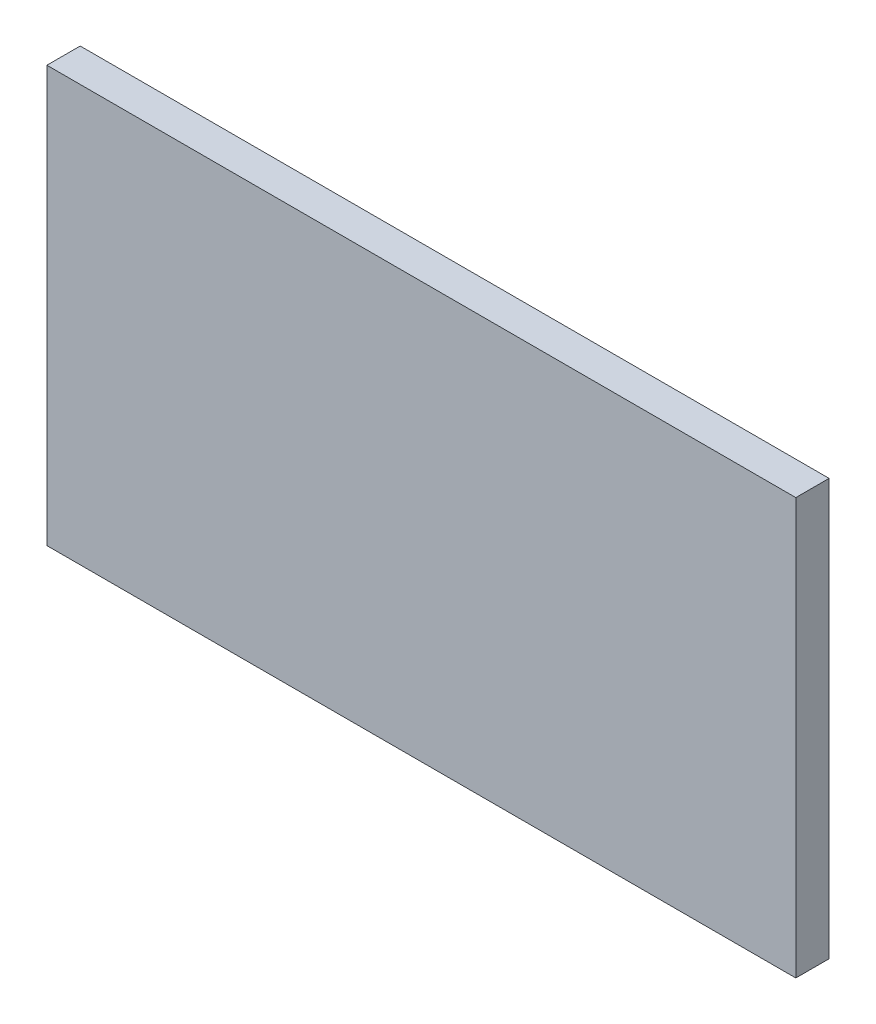
ISO-10303-21;
HEADER;
FILE_DESCRIPTION(('STEP AP214'),'2;1');
FILE_NAME('part.step','',(''),(''),'','','');
FILE_SCHEMA(('AUTOMOTIVE_DESIGN { 1 0 10303 214 1 1 1 1 }'));
ENDSEC;
DATA;
#1=APPLICATION_CONTEXT('core data for automotive mechanical design processes');
#2=APPLICATION_PROTOCOL_DEFINITION('international standard','automotive_design',2000,#1);
#3=PRODUCT_CONTEXT('',#1,'mechanical');
#4=PRODUCT('Part','Part','',(#3));
#5=PRODUCT_RELATED_PRODUCT_CATEGORY('part','',(#4));
#6=PRODUCT_DEFINITION_FORMATION('','',#4);
#7=PRODUCT_DEFINITION_CONTEXT('part definition',#1,'design');
#8=PRODUCT_DEFINITION('design','',#6,#7);
#9=PRODUCT_DEFINITION_SHAPE('','',#8);
#10=(LENGTH_UNIT() NAMED_UNIT(*) SI_UNIT(.MILLI.,.METRE.));
#11=(NAMED_UNIT(*) PLANE_ANGLE_UNIT() SI_UNIT($,.RADIAN.));
#12=(NAMED_UNIT(*) SI_UNIT($,.STERADIAN.) SOLID_ANGLE_UNIT());
#13=UNCERTAINTY_MEASURE_WITH_UNIT(LENGTH_MEASURE(1.E-05),#10,'distance_accuracy_value','');
#14=(GEOMETRIC_REPRESENTATION_CONTEXT(3) GLOBAL_UNCERTAINTY_ASSIGNED_CONTEXT((#13)) GLOBAL_UNIT_ASSIGNED_CONTEXT((#10,
#11,#12)) REPRESENTATION_CONTEXT('',''));
#15=CARTESIAN_POINT('',(0.,0.,0.));
#16=DIRECTION('',(0.,0.,1.));
#17=DIRECTION('',(1.,0.,0.));
#18=AXIS2_PLACEMENT_3D('',#15,#16,#17);
#19=CARTESIAN_POINT('',(-66.4474555470462,33.6330859537639,8.));
#20=DIRECTION('',(1.,0.,0.));
#21=DIRECTION('',(0.,1.,0.));
#22=AXIS2_PLACEMENT_3D('',#19,#20,#21);
#23=PLANE('',#22);
#24=DIRECTION('',(0.,-1.,0.));
#25=VECTOR('',#24,1.);
#26=CARTESIAN_POINT('',(-66.4474555470462,33.6330859537639,0.));
#27=LINE('',#26,#25);
#28=CARTESIAN_POINT('',(-66.4474555470462,33.6330859537639,0.));
#29=VERTEX_POINT('',#28);
#30=CARTESIAN_POINT('',(-66.4474555470461,-66.3669140462361,0.));
#31=VERTEX_POINT('',#30);
#32=EDGE_CURVE('E98',#29,#31,#27,.T.);
#33=ORIENTED_EDGE('',*,*,#32,.T.);
#34=DIRECTION('',(0.,0.,-1.));
#35=VECTOR('',#34,1.);
#36=CARTESIAN_POINT('',(-66.4474555470461,-66.3669140462361,8.));
#37=LINE('',#36,#35);
#38=CARTESIAN_POINT('',(-66.4474555470461,-66.3669140462361,8.));
#39=VERTEX_POINT('',#38);
#40=EDGE_CURVE('E11',#39,#31,#37,.T.);
#41=ORIENTED_EDGE('',*,*,#40,.F.);
#42=DIRECTION('',(0.,-1.,0.));
#43=VECTOR('',#42,1.);
#44=CARTESIAN_POINT('',(-66.4474555470462,33.6330859537639,8.));
#45=LINE('',#44,#43);
#46=CARTESIAN_POINT('',(-66.4474555470462,33.6330859537639,8.));
#47=VERTEX_POINT('',#46);
#48=EDGE_CURVE('E86',#47,#39,#45,.T.);
#49=ORIENTED_EDGE('',*,*,#48,.F.);
#50=DIRECTION('',(0.,0.,-1.));
#51=VECTOR('',#50,1.);
#52=CARTESIAN_POINT('',(-66.4474555470462,33.6330859537639,8.));
#53=LINE('',#52,#51);
#54=EDGE_CURVE('E94',#47,#29,#53,.T.);
#55=ORIENTED_EDGE('',*,*,#54,.T.);
#56=EDGE_LOOP('',(#33,#41,#49,#55));
#57=FACE_BOUND('',#56,.T.);
#58=ADVANCED_FACE('F35',(#57),#23,.F.);
#59=CARTESIAN_POINT('',(-66.4474555470461,-66.3669140462361,8.));
#60=DIRECTION('',(0.,1.,0.));
#61=DIRECTION('',(0.,0.,1.));
#62=AXIS2_PLACEMENT_3D('',#59,#60,#61);
#63=PLANE('',#62);
#64=DIRECTION('',(1.,0.,0.));
#65=VECTOR('',#64,1.);
#66=CARTESIAN_POINT('',(-66.4474555470461,-66.3669140462361,0.));
#67=LINE('',#66,#65);
#68=CARTESIAN_POINT('',(113.552544452954,-66.3669140462361,0.));
#69=VERTEX_POINT('',#68);
#70=EDGE_CURVE('E90',#31,#69,#67,.T.);
#71=ORIENTED_EDGE('',*,*,#70,.T.);
#72=DIRECTION('',(0.,0.,-1.));
#73=VECTOR('',#72,1.);
#74=CARTESIAN_POINT('',(113.552544452954,-66.3669140462361,8.));
#75=LINE('',#74,#73);
#76=CARTESIAN_POINT('',(113.552544452954,-66.3669140462361,8.));
#77=VERTEX_POINT('',#76);
#78=EDGE_CURVE('E43',#77,#69,#75,.T.);
#79=ORIENTED_EDGE('',*,*,#78,.F.);
#80=DIRECTION('',(1.,0.,0.));
#81=VECTOR('',#80,1.);
#82=CARTESIAN_POINT('',(-66.4474555470461,-66.3669140462361,8.));
#83=LINE('',#82,#81);
#84=EDGE_CURVE('E81',#39,#77,#83,.T.);
#85=ORIENTED_EDGE('',*,*,#84,.F.);
#86=ORIENTED_EDGE('',*,*,#40,.T.);
#87=EDGE_LOOP('',(#71,#79,#85,#86));
#88=FACE_BOUND('',#87,.T.);
#89=ADVANCED_FACE('F89',(#88),#63,.F.);
#90=CARTESIAN_POINT('',(113.552544452954,33.6330859537639,8.));
#91=DIRECTION('',(-1.,0.,0.));
#92=DIRECTION('',(0.,0.,1.));
#93=AXIS2_PLACEMENT_3D('',#90,#91,#92);
#94=PLANE('',#93);
#95=DIRECTION('',(0.,1.,0.));
#96=VECTOR('',#95,1.);
#97=CARTESIAN_POINT('',(113.552544452954,33.6330859537639,0.));
#98=LINE('',#97,#96);
#99=CARTESIAN_POINT('',(113.552544452954,33.6330859537639,0.));
#100=VERTEX_POINT('',#99);
#101=EDGE_CURVE('E68',#69,#100,#98,.T.);
#102=ORIENTED_EDGE('',*,*,#101,.T.);
#103=DIRECTION('',(0.,0.,-1.));
#104=VECTOR('',#103,1.);
#105=CARTESIAN_POINT('',(113.552544452954,33.6330859537639,8.));
#106=LINE('',#105,#104);
#107=CARTESIAN_POINT('',(113.552544452954,33.6330859537639,8.));
#108=VERTEX_POINT('',#107);
#109=EDGE_CURVE('E91',#108,#100,#106,.T.);
#110=ORIENTED_EDGE('',*,*,#109,.F.);
#111=DIRECTION('',(0.,1.,0.));
#112=VECTOR('',#111,1.);
#113=CARTESIAN_POINT('',(113.552544452954,33.6330859537639,8.));
#114=LINE('',#113,#112);
#115=EDGE_CURVE('E84',#77,#108,#114,.T.);
#116=ORIENTED_EDGE('',*,*,#115,.F.);
#117=ORIENTED_EDGE('',*,*,#78,.T.);
#118=EDGE_LOOP('',(#102,#110,#116,#117));
#119=FACE_BOUND('',#118,.T.);
#120=ADVANCED_FACE('F92',(#119),#94,.F.);
#121=CARTESIAN_POINT('',(-66.4474555470462,33.6330859537639,8.));
#122=DIRECTION('',(0.,-1.,0.));
#123=DIRECTION('',(0.,0.,-1.));
#124=AXIS2_PLACEMENT_3D('',#121,#122,#123);
#125=PLANE('',#124);
#126=DIRECTION('',(-1.,0.,0.));
#127=VECTOR('',#126,1.);
#128=CARTESIAN_POINT('',(-66.4474555470462,33.6330859537639,0.));
#129=LINE('',#128,#127);
#130=EDGE_CURVE('E74',#100,#29,#129,.T.);
#131=ORIENTED_EDGE('',*,*,#130,.T.);
#132=ORIENTED_EDGE('',*,*,#54,.F.);
#133=DIRECTION('',(-1.,0.,0.));
#134=VECTOR('',#133,1.);
#135=CARTESIAN_POINT('',(-66.4474555470462,33.6330859537639,8.));
#136=LINE('',#135,#134);
#137=EDGE_CURVE('E51',#108,#47,#136,.T.);
#138=ORIENTED_EDGE('',*,*,#137,.F.);
#139=ORIENTED_EDGE('',*,*,#109,.T.);
#140=EDGE_LOOP('',(#131,#132,#138,#139));
#141=FACE_BOUND('',#140,.T.);
#142=ADVANCED_FACE('F105',(#141),#125,.F.);
#143=CARTESIAN_POINT('',(0.,0.,8.));
#144=DIRECTION('',(0.,0.,1.));
#145=DIRECTION('',(1.,0.,0.));
#146=AXIS2_PLACEMENT_3D('',#143,#144,#145);
#147=PLANE('',#146);
#148=ORIENTED_EDGE('',*,*,#48,.T.);
#149=ORIENTED_EDGE('',*,*,#84,.T.);
#150=ORIENTED_EDGE('',*,*,#115,.T.);
#151=ORIENTED_EDGE('',*,*,#137,.T.);
#152=EDGE_LOOP('',(#148,#149,#150,#151));
#153=FACE_BOUND('',#152,.T.);
#154=ADVANCED_FACE('F82',(#153),#147,.T.);
#155=CARTESIAN_POINT('',(0.,0.,0.));
#156=DIRECTION('',(0.,0.,1.));
#157=DIRECTION('',(1.,0.,0.));
#158=AXIS2_PLACEMENT_3D('',#155,#156,#157);
#159=PLANE('',#158);
#160=ORIENTED_EDGE('',*,*,#32,.F.);
#161=ORIENTED_EDGE('',*,*,#130,.F.);
#162=ORIENTED_EDGE('',*,*,#101,.F.);
#163=ORIENTED_EDGE('',*,*,#70,.F.);
#164=EDGE_LOOP('',(#160,#161,#162,#163));
#165=FACE_BOUND('',#164,.T.);
#166=ADVANCED_FACE('F108',(#165),#159,.F.);
#167=CLOSED_SHELL('',(#58,#89,#120,#142,#154,#166));
#168=MANIFOLD_SOLID_BREP('B2',#167);
#169=ADVANCED_BREP_SHAPE_REPRESENTATION('',(#18,#168),#14);
#170=SHAPE_DEFINITION_REPRESENTATION(#9,#169);
ENDSEC;
END-ISO-10303-21;
